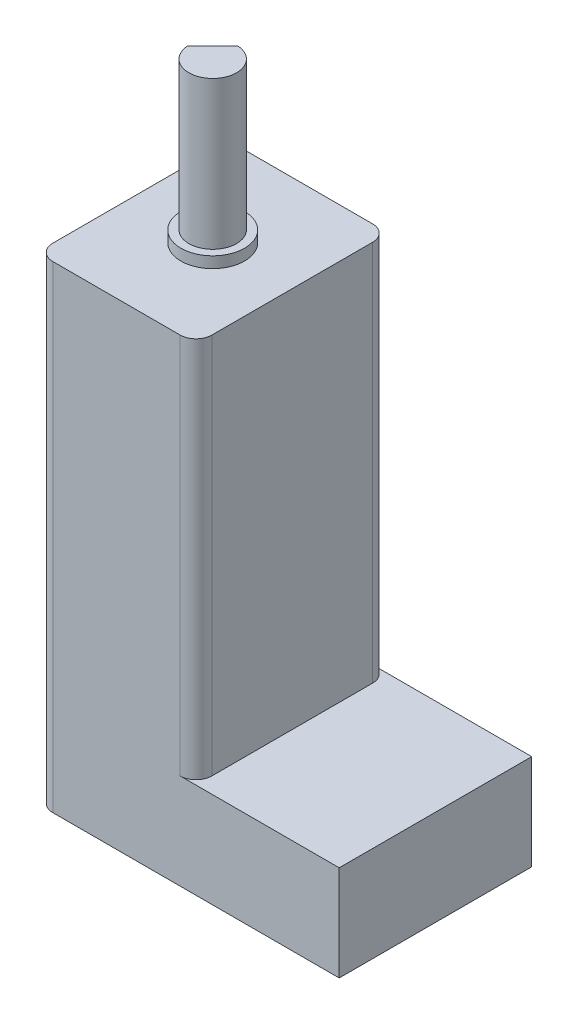
ISO-10303-21;
HEADER;
FILE_DESCRIPTION(('STEP AP214'),'2;1');
FILE_NAME('part.step','',(''),(''),'','','');
FILE_SCHEMA(('AUTOMOTIVE_DESIGN { 1 0 10303 214 1 1 1 1 }'));
ENDSEC;
DATA;
#1=APPLICATION_CONTEXT('core data for automotive mechanical design processes');
#2=APPLICATION_PROTOCOL_DEFINITION('international standard','automotive_design',2000,#1);
#3=PRODUCT_CONTEXT('',#1,'mechanical');
#4=PRODUCT('Part','Part','',(#3));
#5=PRODUCT_RELATED_PRODUCT_CATEGORY('part','',(#4));
#6=PRODUCT_DEFINITION_FORMATION('','',#4);
#7=PRODUCT_DEFINITION_CONTEXT('part definition',#1,'design');
#8=PRODUCT_DEFINITION('design','',#6,#7);
#9=PRODUCT_DEFINITION_SHAPE('','',#8);
#10=(LENGTH_UNIT() NAMED_UNIT(*) SI_UNIT(.MILLI.,.METRE.));
#11=(NAMED_UNIT(*) PLANE_ANGLE_UNIT() SI_UNIT($,.RADIAN.));
#12=(NAMED_UNIT(*) SI_UNIT($,.STERADIAN.) SOLID_ANGLE_UNIT());
#13=UNCERTAINTY_MEASURE_WITH_UNIT(LENGTH_MEASURE(1.E-05),#10,'distance_accuracy_value','');
#14=(GEOMETRIC_REPRESENTATION_CONTEXT(3) GLOBAL_UNCERTAINTY_ASSIGNED_CONTEXT((#13)) GLOBAL_UNIT_ASSIGNED_CONTEXT((#10,
#11,#12)) REPRESENTATION_CONTEXT('',''));
#15=CARTESIAN_POINT('',(0.,0.,0.));
#16=DIRECTION('',(0.,0.,1.));
#17=DIRECTION('',(1.,0.,0.));
#18=AXIS2_PLACEMENT_3D('',#15,#16,#17);
#19=CARTESIAN_POINT('',(5.,30.,-6.05));
#20=DIRECTION('',(-1.,0.,0.));
#21=DIRECTION('',(0.,0.,1.));
#22=AXIS2_PLACEMENT_3D('',#19,#20,#21);
#23=PLANE('',#22);
#24=DIRECTION('',(0.,0.,1.));
#25=VECTOR('',#24,1.);
#26=CARTESIAN_POINT('',(5.,6.,-6.05));
#27=LINE('',#26,#25);
#28=CARTESIAN_POINT('',(5.,6.,-5.05));
#29=VERTEX_POINT('',#28);
#30=CARTESIAN_POINT('',(5.,6.,5.05));
#31=VERTEX_POINT('',#30);
#32=EDGE_CURVE('E55',#29,#31,#27,.T.);
#33=ORIENTED_EDGE('',*,*,#32,.F.);
#34=DIRECTION('',(0.,-1.,0.));
#35=VECTOR('',#34,1.);
#36=CARTESIAN_POINT('',(5.,30.,-5.05));
#37=LINE('',#36,#35);
#38=CARTESIAN_POINT('',(5.,30.,-5.05));
#39=VERTEX_POINT('',#38);
#40=EDGE_CURVE('E241',#29,#39,#37,.F.);
#41=ORIENTED_EDGE('',*,*,#40,.T.);
#42=DIRECTION('',(0.,0.,-1.));
#43=VECTOR('',#42,1.);
#44=CARTESIAN_POINT('',(5.,30.,-6.05));
#45=LINE('',#44,#43);
#46=CARTESIAN_POINT('',(5.,30.,5.05));
#47=VERTEX_POINT('',#46);
#48=EDGE_CURVE('E138',#47,#39,#45,.T.);
#49=ORIENTED_EDGE('',*,*,#48,.F.);
#50=DIRECTION('',(0.,-1.,0.));
#51=VECTOR('',#50,1.);
#52=CARTESIAN_POINT('',(5.,30.,5.05));
#53=LINE('',#52,#51);
#54=EDGE_CURVE('E237',#47,#31,#53,.T.);
#55=ORIENTED_EDGE('',*,*,#54,.T.);
#56=EDGE_LOOP('',(#33,#41,#49,#55));
#57=FACE_BOUND('',#56,.T.);
#58=ADVANCED_FACE('F39',(#57),#23,.F.);
#59=CARTESIAN_POINT('',(4.,30.,-5.05));
#60=DIRECTION('',(0.,-1.,0.));
#61=DIRECTION('',(0.,0.,-1.));
#62=AXIS2_PLACEMENT_3D('',#59,#60,#61);
#63=CYLINDRICAL_SURFACE('',#62,1.);
#64=ORIENTED_EDGE('',*,*,#40,.F.);
#65=CARTESIAN_POINT('',(4.,6.,-5.05));
#66=DIRECTION('',(0.,-1.,0.));
#67=DIRECTION('',(0.,0.,-1.));
#68=AXIS2_PLACEMENT_3D('',#65,#66,#67);
#69=CIRCLE('',#68,1.);
#70=CARTESIAN_POINT('',(4.,6.,-6.05));
#71=VERTEX_POINT('',#70);
#72=EDGE_CURVE('E170',#29,#71,#69,.F.);
#73=ORIENTED_EDGE('',*,*,#72,.T.);
#74=DIRECTION('',(0.,-1.,0.));
#75=VECTOR('',#74,1.);
#76=CARTESIAN_POINT('',(4.,30.,-6.05));
#77=LINE('',#76,#75);
#78=CARTESIAN_POINT('',(4.,30.,-6.05));
#79=VERTEX_POINT('',#78);
#80=EDGE_CURVE('E227',#79,#71,#77,.T.);
#81=ORIENTED_EDGE('',*,*,#80,.F.);
#82=CARTESIAN_POINT('',(4.,30.,-5.05));
#83=DIRECTION('',(0.,1.,0.));
#84=DIRECTION('',(0.,0.,1.));
#85=AXIS2_PLACEMENT_3D('',#82,#83,#84);
#86=CIRCLE('',#85,1.);
#87=EDGE_CURVE('E253',#39,#79,#86,.T.);
#88=ORIENTED_EDGE('',*,*,#87,.F.);
#89=EDGE_LOOP('',(#64,#73,#81,#88));
#90=FACE_BOUND('',#89,.T.);
#91=ADVANCED_FACE('F294',(#90),#63,.T.);
#92=CARTESIAN_POINT('',(4.,30.,5.05));
#93=DIRECTION('',(0.,-1.,0.));
#94=DIRECTION('',(0.,0.,-1.));
#95=AXIS2_PLACEMENT_3D('',#92,#93,#94);
#96=CYLINDRICAL_SURFACE('',#95,1.);
#97=DIRECTION('',(0.,-1.,0.));
#98=VECTOR('',#97,1.);
#99=CARTESIAN_POINT('',(4.,30.,6.05));
#100=LINE('',#99,#98);
#101=CARTESIAN_POINT('',(4.,6.,6.05));
#102=VERTEX_POINT('',#101);
#103=CARTESIAN_POINT('',(4.,30.,6.05));
#104=VERTEX_POINT('',#103);
#105=EDGE_CURVE('E62',#102,#104,#100,.F.);
#106=ORIENTED_EDGE('',*,*,#105,.F.);
#107=CARTESIAN_POINT('',(4.,6.,5.05));
#108=DIRECTION('',(0.,-1.,0.));
#109=DIRECTION('',(0.,0.,-1.));
#110=AXIS2_PLACEMENT_3D('',#107,#108,#109);
#111=CIRCLE('',#110,1.);
#112=EDGE_CURVE('E11',#102,#31,#111,.F.);
#113=ORIENTED_EDGE('',*,*,#112,.T.);
#114=ORIENTED_EDGE('',*,*,#54,.F.);
#115=CARTESIAN_POINT('',(4.,30.,5.05));
#116=DIRECTION('',(0.,1.,0.));
#117=DIRECTION('',(0.,0.,1.));
#118=AXIS2_PLACEMENT_3D('',#115,#116,#117);
#119=CIRCLE('',#118,1.);
#120=EDGE_CURVE('E244',#104,#47,#119,.T.);
#121=ORIENTED_EDGE('',*,*,#120,.F.);
#122=EDGE_LOOP('',(#106,#113,#114,#121));
#123=FACE_BOUND('',#122,.T.);
#124=ADVANCED_FACE('F41',(#123),#96,.T.);
#125=CARTESIAN_POINT('',(-5.,30.,-6.05));
#126=DIRECTION('',(0.,0.,1.));
#127=DIRECTION('',(1.,0.,0.));
#128=AXIS2_PLACEMENT_3D('',#125,#126,#127);
#129=PLANE('',#128);
#130=ORIENTED_EDGE('',*,*,#80,.T.);
#131=DIRECTION('',(-1.,0.,0.));
#132=VECTOR('',#131,1.);
#133=CARTESIAN_POINT('',(14.,6.,-6.05));
#134=LINE('',#133,#132);
#135=CARTESIAN_POINT('',(14.,6.,-6.05));
#136=VERTEX_POINT('',#135);
#137=EDGE_CURVE('E165',#136,#71,#134,.T.);
#138=ORIENTED_EDGE('',*,*,#137,.F.);
#139=DIRECTION('',(0.,1.,0.));
#140=VECTOR('',#139,1.);
#141=CARTESIAN_POINT('',(14.,6.,-6.05));
#142=LINE('',#141,#140);
#143=CARTESIAN_POINT('',(14.,0.,-6.05));
#144=VERTEX_POINT('',#143);
#145=EDGE_CURVE('E149',#144,#136,#142,.T.);
#146=ORIENTED_EDGE('',*,*,#145,.F.);
#147=DIRECTION('',(-1.,0.,0.));
#148=VECTOR('',#147,1.);
#149=CARTESIAN_POINT('',(-5.,0.,-6.05));
#150=LINE('',#149,#148);
#151=CARTESIAN_POINT('',(-4.,0.,-6.05));
#152=VERTEX_POINT('',#151);
#153=EDGE_CURVE('E145',#144,#152,#150,.T.);
#154=ORIENTED_EDGE('',*,*,#153,.T.);
#155=DIRECTION('',(0.,-1.,0.));
#156=VECTOR('',#155,1.);
#157=CARTESIAN_POINT('',(-4.,30.,-6.05));
#158=LINE('',#157,#156);
#159=CARTESIAN_POINT('',(-4.,30.,-6.05));
#160=VERTEX_POINT('',#159);
#161=EDGE_CURVE('E205',#152,#160,#158,.F.);
#162=ORIENTED_EDGE('',*,*,#161,.T.);
#163=DIRECTION('',(-1.,0.,0.));
#164=VECTOR('',#163,1.);
#165=CARTESIAN_POINT('',(-5.,30.,-6.05));
#166=LINE('',#165,#164);
#167=EDGE_CURVE('E210',#79,#160,#166,.T.);
#168=ORIENTED_EDGE('',*,*,#167,.F.);
#169=EDGE_LOOP('',(#130,#138,#146,#154,#162,#168));
#170=FACE_BOUND('',#169,.T.);
#171=ADVANCED_FACE('F282',(#170),#129,.F.);
#172=CARTESIAN_POINT('',(-5.,30.,-6.05));
#173=DIRECTION('',(1.,0.,0.));
#174=DIRECTION('',(0.,0.,-1.));
#175=AXIS2_PLACEMENT_3D('',#172,#173,#174);
#176=PLANE('',#175);
#177=DIRECTION('',(0.,0.,1.));
#178=VECTOR('',#177,1.);
#179=CARTESIAN_POINT('',(-5.,30.,-6.05));
#180=LINE('',#179,#178);
#181=CARTESIAN_POINT('',(-5.,30.,-5.05));
#182=VERTEX_POINT('',#181);
#183=CARTESIAN_POINT('',(-5.,30.,5.05));
#184=VERTEX_POINT('',#183);
#185=EDGE_CURVE('E214',#182,#184,#180,.T.);
#186=ORIENTED_EDGE('',*,*,#185,.F.);
#187=DIRECTION('',(0.,-1.,0.));
#188=VECTOR('',#187,1.);
#189=CARTESIAN_POINT('',(-5.,30.,-5.05));
#190=LINE('',#189,#188);
#191=CARTESIAN_POINT('',(-5.,0.,-5.05));
#192=VERTEX_POINT('',#191);
#193=EDGE_CURVE('E259',#182,#192,#190,.T.);
#194=ORIENTED_EDGE('',*,*,#193,.T.);
#195=DIRECTION('',(0.,0.,1.));
#196=VECTOR('',#195,1.);
#197=CARTESIAN_POINT('',(-5.,0.,-6.05));
#198=LINE('',#197,#196);
#199=CARTESIAN_POINT('',(-5.,0.,5.05));
#200=VERTEX_POINT('',#199);
#201=EDGE_CURVE('E139',#192,#200,#198,.T.);
#202=ORIENTED_EDGE('',*,*,#201,.T.);
#203=DIRECTION('',(0.,-1.,0.));
#204=VECTOR('',#203,1.);
#205=CARTESIAN_POINT('',(-5.,30.,5.05));
#206=LINE('',#205,#204);
#207=EDGE_CURVE('E256',#200,#184,#206,.F.);
#208=ORIENTED_EDGE('',*,*,#207,.T.);
#209=EDGE_LOOP('',(#186,#194,#202,#208));
#210=FACE_BOUND('',#209,.T.);
#211=ADVANCED_FACE('F269',(#210),#176,.F.);
#212=CARTESIAN_POINT('',(-5.,30.,6.05));
#213=DIRECTION('',(0.,0.,-1.));
#214=DIRECTION('',(-1.,0.,0.));
#215=AXIS2_PLACEMENT_3D('',#212,#213,#214);
#216=PLANE('',#215);
#217=DIRECTION('',(1.,0.,0.));
#218=VECTOR('',#217,1.);
#219=CARTESIAN_POINT('',(-5.,0.,6.05));
#220=LINE('',#219,#218);
#221=CARTESIAN_POINT('',(-4.,0.,6.05));
#222=VERTEX_POINT('',#221);
#223=CARTESIAN_POINT('',(14.,0.,6.05));
#224=VERTEX_POINT('',#223);
#225=EDGE_CURVE('E130',#222,#224,#220,.T.);
#226=ORIENTED_EDGE('',*,*,#225,.T.);
#227=DIRECTION('',(0.,-1.,0.));
#228=VECTOR('',#227,1.);
#229=CARTESIAN_POINT('',(14.,6.,6.05));
#230=LINE('',#229,#228);
#231=CARTESIAN_POINT('',(14.,6.,6.05));
#232=VERTEX_POINT('',#231);
#233=EDGE_CURVE('E134',#232,#224,#230,.T.);
#234=ORIENTED_EDGE('',*,*,#233,.F.);
#235=DIRECTION('',(-1.,0.,0.));
#236=VECTOR('',#235,1.);
#237=CARTESIAN_POINT('',(14.,6.,6.05));
#238=LINE('',#237,#236);
#239=EDGE_CURVE('E162',#232,#102,#238,.T.);
#240=ORIENTED_EDGE('',*,*,#239,.T.);
#241=ORIENTED_EDGE('',*,*,#105,.T.);
#242=DIRECTION('',(1.,0.,0.));
#243=VECTOR('',#242,1.);
#244=CARTESIAN_POINT('',(-5.,30.,6.05));
#245=LINE('',#244,#243);
#246=CARTESIAN_POINT('',(-4.,30.,6.05));
#247=VERTEX_POINT('',#246);
#248=EDGE_CURVE('E206',#247,#104,#245,.T.);
#249=ORIENTED_EDGE('',*,*,#248,.F.);
#250=DIRECTION('',(0.,-1.,0.));
#251=VECTOR('',#250,1.);
#252=CARTESIAN_POINT('',(-4.,30.,6.05));
#253=LINE('',#252,#251);
#254=EDGE_CURVE('E48',#247,#222,#253,.T.);
#255=ORIENTED_EDGE('',*,*,#254,.T.);
#256=EDGE_LOOP('',(#226,#234,#240,#241,#249,#255));
#257=FACE_BOUND('',#256,.T.);
#258=ADVANCED_FACE('F132',(#257),#216,.F.);
#259=CARTESIAN_POINT('',(0.,30.,0.));
#260=DIRECTION('',(0.,1.,0.));
#261=DIRECTION('',(0.,0.,1.));
#262=AXIS2_PLACEMENT_3D('',#259,#260,#261);
#263=PLANE('',#262);
#264=CARTESIAN_POINT('',(0.,30.,0.));
#265=DIRECTION('',(0.,1.,0.));
#266=DIRECTION('',(0.,0.,1.));
#267=AXIS2_PLACEMENT_3D('',#264,#265,#266);
#268=CIRCLE('',#267,2.);
#269=CARTESIAN_POINT('',(0.,30.,2.));
#270=VERTEX_POINT('',#269);
#271=EDGE_CURVE('E201',#270,#270,#268,.T.);
#272=ORIENTED_EDGE('',*,*,#271,.F.);
#273=EDGE_LOOP('',(#272));
#274=FACE_BOUND('',#273,.T.);
#275=ORIENTED_EDGE('',*,*,#48,.T.);
#276=ORIENTED_EDGE('',*,*,#87,.T.);
#277=ORIENTED_EDGE('',*,*,#167,.T.);
#278=CARTESIAN_POINT('',(-4.,30.,-5.05));
#279=DIRECTION('',(0.,1.,0.));
#280=DIRECTION('',(0.,0.,1.));
#281=AXIS2_PLACEMENT_3D('',#278,#279,#280);
#282=CIRCLE('',#281,1.);
#283=EDGE_CURVE('E250',#160,#182,#282,.T.);
#284=ORIENTED_EDGE('',*,*,#283,.T.);
#285=ORIENTED_EDGE('',*,*,#185,.T.);
#286=CARTESIAN_POINT('',(-4.,30.,5.05));
#287=DIRECTION('',(0.,1.,0.));
#288=DIRECTION('',(0.,0.,1.));
#289=AXIS2_PLACEMENT_3D('',#286,#287,#288);
#290=CIRCLE('',#289,1.);
#291=EDGE_CURVE('E247',#184,#247,#290,.T.);
#292=ORIENTED_EDGE('',*,*,#291,.T.);
#293=ORIENTED_EDGE('',*,*,#248,.T.);
#294=ORIENTED_EDGE('',*,*,#120,.T.);
#295=EDGE_LOOP('',(#275,#276,#277,#284,#285,#292,#293,#294));
#296=FACE_BOUND('',#295,.T.);
#297=ADVANCED_FACE('F278',(#274,#296),#263,.T.);
#298=CARTESIAN_POINT('',(0.,0.,0.));
#299=DIRECTION('',(0.,1.,0.));
#300=DIRECTION('',(0.,0.,1.));
#301=AXIS2_PLACEMENT_3D('',#298,#299,#300);
#302=PLANE('',#301);
#303=DIRECTION('',(0.,0.,-1.));
#304=VECTOR('',#303,1.);
#305=CARTESIAN_POINT('',(14.,0.,6.05));
#306=LINE('',#305,#304);
#307=EDGE_CURVE('E142',#224,#144,#306,.T.);
#308=ORIENTED_EDGE('',*,*,#307,.F.);
#309=ORIENTED_EDGE('',*,*,#225,.F.);
#310=CARTESIAN_POINT('',(-4.,0.,5.05));
#311=DIRECTION('',(0.,1.,0.));
#312=DIRECTION('',(0.,0.,1.));
#313=AXIS2_PLACEMENT_3D('',#310,#311,#312);
#314=CIRCLE('',#313,1.);
#315=EDGE_CURVE('E231',#222,#200,#314,.F.);
#316=ORIENTED_EDGE('',*,*,#315,.T.);
#317=ORIENTED_EDGE('',*,*,#201,.F.);
#318=CARTESIAN_POINT('',(-4.,0.,-5.05));
#319=DIRECTION('',(0.,1.,0.));
#320=DIRECTION('',(0.,0.,1.));
#321=AXIS2_PLACEMENT_3D('',#318,#319,#320);
#322=CIRCLE('',#321,1.);
#323=EDGE_CURVE('E234',#192,#152,#322,.F.);
#324=ORIENTED_EDGE('',*,*,#323,.T.);
#325=ORIENTED_EDGE('',*,*,#153,.F.);
#326=EDGE_LOOP('',(#308,#309,#316,#317,#324,#325));
#327=FACE_BOUND('',#326,.T.);
#328=ADVANCED_FACE('F143',(#327),#302,.F.);
#329=CARTESIAN_POINT('',(0.,30.7,0.));
#330=DIRECTION('',(0.,-1.,0.));
#331=DIRECTION('',(0.,0.,-1.));
#332=AXIS2_PLACEMENT_3D('',#329,#330,#331);
#333=CYLINDRICAL_SURFACE('',#332,2.);
#334=CARTESIAN_POINT('',(0.,30.7,0.));
#335=DIRECTION('',(0.,1.,0.));
#336=DIRECTION('',(0.,0.,1.));
#337=AXIS2_PLACEMENT_3D('',#334,#335,#336);
#338=CIRCLE('',#337,2.);
#339=CARTESIAN_POINT('',(0.,30.7,2.));
#340=VERTEX_POINT('',#339);
#341=EDGE_CURVE('E197',#340,#340,#338,.T.);
#342=ORIENTED_EDGE('',*,*,#341,.F.);
#343=EDGE_LOOP('',(#342));
#344=FACE_BOUND('',#343,.T.);
#345=ORIENTED_EDGE('',*,*,#271,.T.);
#346=EDGE_LOOP('',(#345));
#347=FACE_BOUND('',#346,.T.);
#348=ADVANCED_FACE('F330',(#344,#347),#333,.T.);
#349=CARTESIAN_POINT('',(0.,30.7,0.));
#350=DIRECTION('',(0.,1.,0.));
#351=DIRECTION('',(0.,0.,1.));
#352=AXIS2_PLACEMENT_3D('',#349,#350,#351);
#353=PLANE('',#352);
#354=DIRECTION('',(-0.707106781186548,0.,0.707106781186548));
#355=VECTOR('',#354,1.);
#356=CARTESIAN_POINT('',(-0.707106781186547,30.7,-0.707106781186547));
#357=LINE('',#356,#355);
#358=CARTESIAN_POINT('',(0.0834626338555474,30.7,-1.49767619622864));
#359=VERTEX_POINT('',#358);
#360=CARTESIAN_POINT('',(-1.49767619622864,30.7,0.0834626338555474));
#361=VERTEX_POINT('',#360);
#362=EDGE_CURVE('E174',#359,#361,#357,.T.);
#363=ORIENTED_EDGE('',*,*,#362,.F.);
#364=CARTESIAN_POINT('',(0.,30.7,0.));
#365=DIRECTION('',(0.,1.,0.));
#366=DIRECTION('',(0.,0.,1.));
#367=AXIS2_PLACEMENT_3D('',#364,#365,#366);
#368=CIRCLE('',#367,1.5);
#369=EDGE_CURVE('E180',#361,#359,#368,.T.);
#370=ORIENTED_EDGE('',*,*,#369,.F.);
#371=EDGE_LOOP('',(#363,#370));
#372=FACE_BOUND('',#371,.T.);
#373=ORIENTED_EDGE('',*,*,#341,.T.);
#374=EDGE_LOOP('',(#373));
#375=FACE_BOUND('',#374,.T.);
#376=ADVANCED_FACE('F326',(#372,#375),#353,.T.);
#377=CARTESIAN_POINT('',(-0.707106781186547,40.,-0.707106781186547));
#378=DIRECTION('',(0.707106781186548,0.,0.707106781186548));
#379=DIRECTION('',(0.707106781186548,0.,-0.707106781186548));
#380=AXIS2_PLACEMENT_3D('',#377,#378,#379);
#381=PLANE('',#380);
#382=ORIENTED_EDGE('',*,*,#362,.T.);
#383=DIRECTION('',(0.,-1.,0.));
#384=VECTOR('',#383,1.);
#385=CARTESIAN_POINT('',(-1.49767619622864,40.,0.0834626338555474));
#386=LINE('',#385,#384);
#387=CARTESIAN_POINT('',(-1.49767619622864,40.,0.0834626338555474));
#388=VERTEX_POINT('',#387);
#389=EDGE_CURVE('E193',#388,#361,#386,.T.);
#390=ORIENTED_EDGE('',*,*,#389,.F.);
#391=DIRECTION('',(-0.707106781186548,0.,0.707106781186548));
#392=VECTOR('',#391,1.);
#393=CARTESIAN_POINT('',(-0.707106781186547,40.,-0.707106781186547));
#394=LINE('',#393,#392);
#395=CARTESIAN_POINT('',(0.0834626338555474,40.,-1.49767619622864));
#396=VERTEX_POINT('',#395);
#397=EDGE_CURVE('E175',#396,#388,#394,.T.);
#398=ORIENTED_EDGE('',*,*,#397,.F.);
#399=DIRECTION('',(0.,-1.,0.));
#400=VECTOR('',#399,1.);
#401=CARTESIAN_POINT('',(0.0834626338555474,40.,-1.49767619622864));
#402=LINE('',#401,#400);
#403=EDGE_CURVE('E183',#396,#359,#402,.T.);
#404=ORIENTED_EDGE('',*,*,#403,.T.);
#405=EDGE_LOOP('',(#382,#390,#398,#404));
#406=FACE_BOUND('',#405,.T.);
#407=ADVANCED_FACE('F322',(#406),#381,.F.);
#408=CARTESIAN_POINT('',(0.,40.,0.));
#409=DIRECTION('',(0.,-1.,0.));
#410=DIRECTION('',(0.,0.,-1.));
#411=AXIS2_PLACEMENT_3D('',#408,#409,#410);
#412=CYLINDRICAL_SURFACE('',#411,1.5);
#413=ORIENTED_EDGE('',*,*,#369,.T.);
#414=ORIENTED_EDGE('',*,*,#403,.F.);
#415=CARTESIAN_POINT('',(0.,40.,0.));
#416=DIRECTION('',(0.,1.,0.));
#417=DIRECTION('',(0.,0.,1.));
#418=AXIS2_PLACEMENT_3D('',#415,#416,#417);
#419=CIRCLE('',#418,1.5);
#420=EDGE_CURVE('E179',#388,#396,#419,.T.);
#421=ORIENTED_EDGE('',*,*,#420,.F.);
#422=ORIENTED_EDGE('',*,*,#389,.T.);
#423=EDGE_LOOP('',(#413,#414,#421,#422));
#424=FACE_BOUND('',#423,.T.);
#425=ADVANCED_FACE('F318',(#424),#412,.T.);
#426=CARTESIAN_POINT('',(0.,40.,0.));
#427=DIRECTION('',(0.,1.,0.));
#428=DIRECTION('',(0.,0.,1.));
#429=AXIS2_PLACEMENT_3D('',#426,#427,#428);
#430=PLANE('',#429);
#431=ORIENTED_EDGE('',*,*,#397,.T.);
#432=ORIENTED_EDGE('',*,*,#420,.T.);
#433=EDGE_LOOP('',(#431,#432));
#434=FACE_BOUND('',#433,.T.);
#435=ADVANCED_FACE('F305',(#434),#430,.T.);
#436=CARTESIAN_POINT('',(-4.,30.,-5.05));
#437=DIRECTION('',(0.,-1.,0.));
#438=DIRECTION('',(0.,0.,-1.));
#439=AXIS2_PLACEMENT_3D('',#436,#437,#438);
#440=CYLINDRICAL_SURFACE('',#439,1.);
#441=ORIENTED_EDGE('',*,*,#283,.F.);
#442=ORIENTED_EDGE('',*,*,#161,.F.);
#443=ORIENTED_EDGE('',*,*,#323,.F.);
#444=ORIENTED_EDGE('',*,*,#193,.F.);
#445=EDGE_LOOP('',(#441,#442,#443,#444));
#446=FACE_BOUND('',#445,.T.);
#447=ADVANCED_FACE('F280',(#446),#440,.T.);
#448=CARTESIAN_POINT('',(-4.,30.,5.05));
#449=DIRECTION('',(0.,-1.,0.));
#450=DIRECTION('',(0.,0.,-1.));
#451=AXIS2_PLACEMENT_3D('',#448,#449,#450);
#452=CYLINDRICAL_SURFACE('',#451,1.);
#453=ORIENTED_EDGE('',*,*,#291,.F.);
#454=ORIENTED_EDGE('',*,*,#207,.F.);
#455=ORIENTED_EDGE('',*,*,#315,.F.);
#456=ORIENTED_EDGE('',*,*,#254,.F.);
#457=EDGE_LOOP('',(#453,#454,#455,#456));
#458=FACE_BOUND('',#457,.T.);
#459=ADVANCED_FACE('F276',(#458),#452,.T.);
#460=CARTESIAN_POINT('',(14.,6.,6.05));
#461=DIRECTION('',(0.,-1.,0.));
#462=DIRECTION('',(0.,0.,-1.));
#463=AXIS2_PLACEMENT_3D('',#460,#461,#462);
#464=PLANE('',#463);
#465=ORIENTED_EDGE('',*,*,#72,.F.);
#466=ORIENTED_EDGE('',*,*,#32,.T.);
#467=ORIENTED_EDGE('',*,*,#112,.F.);
#468=ORIENTED_EDGE('',*,*,#239,.F.);
#469=DIRECTION('',(0.,0.,1.));
#470=VECTOR('',#469,1.);
#471=CARTESIAN_POINT('',(14.,6.,6.05));
#472=LINE('',#471,#470);
#473=EDGE_CURVE('E153',#136,#232,#472,.T.);
#474=ORIENTED_EDGE('',*,*,#473,.F.);
#475=ORIENTED_EDGE('',*,*,#137,.T.);
#476=EDGE_LOOP('',(#465,#466,#467,#468,#474,#475));
#477=FACE_BOUND('',#476,.T.);
#478=ADVANCED_FACE('F285',(#477),#464,.F.);
#479=CARTESIAN_POINT('',(14.,0.,0.));
#480=DIRECTION('',(1.,0.,0.));
#481=DIRECTION('',(0.,0.,-1.));
#482=AXIS2_PLACEMENT_3D('',#479,#480,#481);
#483=PLANE('',#482);
#484=ORIENTED_EDGE('',*,*,#233,.T.);
#485=ORIENTED_EDGE('',*,*,#307,.T.);
#486=ORIENTED_EDGE('',*,*,#145,.T.);
#487=ORIENTED_EDGE('',*,*,#473,.T.);
#488=EDGE_LOOP('',(#484,#485,#486,#487));
#489=FACE_BOUND('',#488,.T.);
#490=ADVANCED_FACE('F151',(#489),#483,.T.);
#491=CLOSED_SHELL('',(#58,#91,#124,#171,#211,#258,#297,#328,#348,#376,#407,#425,#435,#447,#459,
#478,#490));
#492=MANIFOLD_SOLID_BREP('B2',#491);
#493=ADVANCED_BREP_SHAPE_REPRESENTATION('',(#18,#492),#14);
#494=SHAPE_DEFINITION_REPRESENTATION(#9,#493);
ENDSEC;
END-ISO-10303-21;
